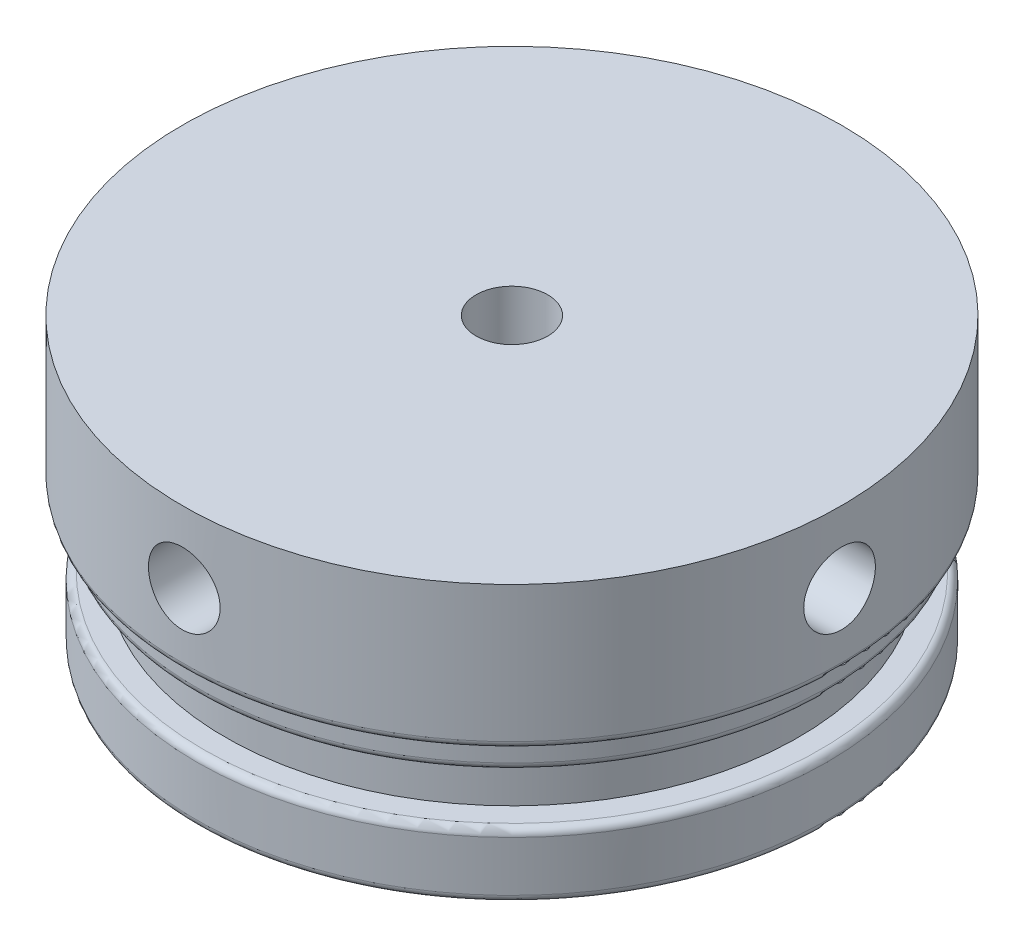
ISO-10303-21;
HEADER;
FILE_DESCRIPTION(('STEP AP214'),'2;1');
FILE_NAME('part.step','',(''),(''),'','','');
FILE_SCHEMA(('AUTOMOTIVE_DESIGN { 1 0 10303 214 1 1 1 1 }'));
ENDSEC;
DATA;
#1=APPLICATION_CONTEXT('core data for automotive mechanical design processes');
#2=APPLICATION_PROTOCOL_DEFINITION('international standard','automotive_design',2000,#1);
#3=PRODUCT_CONTEXT('',#1,'mechanical');
#4=PRODUCT('Part','Part','',(#3));
#5=PRODUCT_RELATED_PRODUCT_CATEGORY('part','',(#4));
#6=PRODUCT_DEFINITION_FORMATION('','',#4);
#7=PRODUCT_DEFINITION_CONTEXT('part definition',#1,'design');
#8=PRODUCT_DEFINITION('design','',#6,#7);
#9=PRODUCT_DEFINITION_SHAPE('','',#8);
#10=(LENGTH_UNIT() NAMED_UNIT(*) SI_UNIT(.MILLI.,.METRE.));
#11=(NAMED_UNIT(*) PLANE_ANGLE_UNIT() SI_UNIT($,.RADIAN.));
#12=(NAMED_UNIT(*) SI_UNIT($,.STERADIAN.) SOLID_ANGLE_UNIT());
#13=UNCERTAINTY_MEASURE_WITH_UNIT(LENGTH_MEASURE(1.E-05),#10,'distance_accuracy_value','');
#14=(GEOMETRIC_REPRESENTATION_CONTEXT(3) GLOBAL_UNCERTAINTY_ASSIGNED_CONTEXT((#13)) GLOBAL_UNIT_ASSIGNED_CONTEXT((#10,
#11,#12)) REPRESENTATION_CONTEXT('',''));
#15=CARTESIAN_POINT('',(0.,0.,0.));
#16=DIRECTION('',(0.,0.,1.));
#17=DIRECTION('',(1.,0.,0.));
#18=AXIS2_PLACEMENT_3D('',#15,#16,#17);
#19=CARTESIAN_POINT('',(22.,0.,0.));
#20=DIRECTION('',(0.,-1.,0.));
#21=DIRECTION('',(0.,0.,-1.));
#22=AXIS2_PLACEMENT_3D('',#19,#20,#21);
#23=PLANE('',#22);
#24=CARTESIAN_POINT('',(0.,0.,0.));
#25=DIRECTION('',(0.,-1.,0.));
#26=DIRECTION('',(0.,0.,-1.));
#27=AXIS2_PLACEMENT_3D('',#24,#25,#26);
#28=CIRCLE('',#27,21.5);
#29=CARTESIAN_POINT('',(0.,0.,-21.5));
#30=VERTEX_POINT('',#29);
#31=EDGE_CURVE('E55',#30,#30,#28,.T.);
#32=ORIENTED_EDGE('',*,*,#31,.T.);
#33=EDGE_LOOP('',(#32));
#34=FACE_BOUND('',#33,.T.);
#35=ADVANCED_FACE('F40',(#34),#23,.T.);
#36=CARTESIAN_POINT('',(0.,20.,0.));
#37=DIRECTION('',(0.,1.,0.));
#38=DIRECTION('',(0.,0.,1.));
#39=AXIS2_PLACEMENT_3D('',#36,#37,#38);
#40=PLANE('',#39);
#41=CARTESIAN_POINT('',(0.,20.,0.));
#42=DIRECTION('',(0.,1.,0.));
#43=DIRECTION('',(0.,0.,1.));
#44=AXIS2_PLACEMENT_3D('',#41,#42,#43);
#45=CIRCLE('',#44,2.5);
#46=CARTESIAN_POINT('',(0.,20.,2.5));
#47=VERTEX_POINT('',#46);
#48=EDGE_CURVE('E368',#47,#47,#45,.T.);
#49=ORIENTED_EDGE('',*,*,#48,.F.);
#50=EDGE_LOOP('',(#49));
#51=FACE_BOUND('',#50,.T.);
#52=CARTESIAN_POINT('',(0.,20.,0.));
#53=DIRECTION('',(0.,-1.,0.));
#54=DIRECTION('',(0.,0.,-1.));
#55=AXIS2_PLACEMENT_3D('',#52,#53,#54);
#56=CIRCLE('',#55,23.);
#57=CARTESIAN_POINT('',(0.,20.,-23.));
#58=VERTEX_POINT('',#57);
#59=EDGE_CURVE('E127',#58,#58,#56,.T.);
#60=ORIENTED_EDGE('',*,*,#59,.F.);
#61=EDGE_LOOP('',(#60));
#62=FACE_BOUND('',#61,.T.);
#63=ADVANCED_FACE('F158',(#51,#62),#40,.T.);
#64=CARTESIAN_POINT('',(0.,0.,0.));
#65=DIRECTION('',(0.,-1.,0.));
#66=DIRECTION('',(0.,0.,-1.));
#67=AXIS2_PLACEMENT_3D('',#64,#65,#66);
#68=CYLINDRICAL_SURFACE('',#67,23.);
#69=CARTESIAN_POINT('',(0.,10.5,0.));
#70=DIRECTION('',(0.,-1.,0.));
#71=DIRECTION('',(0.,0.,-1.));
#72=AXIS2_PLACEMENT_3D('',#69,#70,#71);
#73=CIRCLE('',#72,23.);
#74=CARTESIAN_POINT('',(0.,10.5,-23.));
#75=VERTEX_POINT('',#74);
#76=EDGE_CURVE('E10',#75,#75,#73,.F.);
#77=ORIENTED_EDGE('',*,*,#76,.T.);
#78=EDGE_LOOP('',(#77));
#79=FACE_BOUND('',#78,.T.);
#80=CARTESIAN_POINT('',(2.5,15.,22.8637267303474));
#81=CARTESIAN_POINT('',(2.4999939701255,15.139980349044,22.863728503521));
#82=CARTESIAN_POINT('',(2.48820368084452,15.2800516210515,22.8650261108921));
#83=CARTESIAN_POINT('',(2.44135067528366,15.5563059082258,22.8700752206109));
#84=CARTESIAN_POINT('',(2.40626274061508,15.6924845430413,22.8738293819759));
#85=CARTESIAN_POINT('',(2.31385239669296,15.9569132584398,22.883361452979));
#86=CARTESIAN_POINT('',(2.25654398652915,16.0851682721093,22.8891380882193));
#87=CARTESIAN_POINT('',(2.12134741021566,16.3302130471617,22.9020626705421));
#88=CARTESIAN_POINT('',(2.04346314697372,16.4470049771508,22.9092103574879));
#89=CARTESIAN_POINT('',(1.86896896867891,16.6663332977612,22.9241058533277));
#90=CARTESIAN_POINT('',(1.77228897614597,16.7688137935683,22.9318558408166));
#91=CARTESIAN_POINT('',(1.56309794133541,16.9561283685045,22.9470630013336));
#92=CARTESIAN_POINT('',(1.45058615516232,17.0409616179701,22.9545201605813));
#93=CARTESIAN_POINT('',(1.21257954402684,17.1907695377898,22.9683232666031));
#94=CARTESIAN_POINT('',(1.08705314145865,17.2556943201376,22.9746664050827));
#95=CARTESIAN_POINT('',(0.826799194064805,17.3635230635642,22.9855029727916));
#96=CARTESIAN_POINT('',(0.692071911347285,17.4064276516424,22.989996454687));
#97=CARTESIAN_POINT('',(0.417808135467894,17.468833017808,22.9966121031838));
#98=CARTESIAN_POINT('',(0.278292861863883,17.4884260468078,22.9987436145036));
#99=CARTESIAN_POINT('',(-0.00206087025133014,17.5039377106599,23.0004269854885));
#100=CARTESIAN_POINT('',(-0.142899288585411,17.4998570620556,22.9999789232308));
#101=CARTESIAN_POINT('',(-0.421274729947659,17.4682117798936,22.99656125057));
#102=CARTESIAN_POINT('',(-0.558823179142969,17.440746347983,22.9936022919314));
#103=CARTESIAN_POINT('',(-0.827346629918954,17.3632658564636,22.9855074565526));
#104=CARTESIAN_POINT('',(-0.95832153296524,17.3132504589535,22.9803715471919));
#105=CARTESIAN_POINT('',(-1.21029089072141,17.1919820812213,22.9684817605684));
#106=CARTESIAN_POINT('',(-1.33126420605012,17.1206855161404,22.9617245684661));
#107=CARTESIAN_POINT('',(-1.55956575445769,16.9589103142736,22.9473497213629));
#108=CARTESIAN_POINT('',(-1.66689351411387,16.8684310122469,22.9397320365252));
#109=CARTESIAN_POINT('',(-1.86543892909733,16.6703015327477,22.9244438310016));
#110=CARTESIAN_POINT('',(-1.95657043227679,16.5625650057717,22.9167732407579));
#111=CARTESIAN_POINT('',(-2.11946862499195,16.3332778082672,22.9022828999055));
#112=CARTESIAN_POINT('',(-2.19123527738894,16.2117271112458,22.8954631509285));
#113=CARTESIAN_POINT('',(-2.31336787576821,15.9581923419854,22.8834462992027));
#114=CARTESIAN_POINT('',(-2.36372799118512,15.8262054387994,22.8782496386416));
#115=CARTESIAN_POINT('',(-2.44154715892134,15.5555799033895,22.8700763500121));
#116=CARTESIAN_POINT('',(-2.46900703878971,15.4169415117228,22.8670996417214));
#117=CARTESIAN_POINT('',(-2.50013437561912,15.1377062285502,22.8637174684446));
#118=CARTESIAN_POINT('',(-2.50392258990053,14.9971229500576,22.8632989534723));
#119=CARTESIAN_POINT('',(-2.4879166773991,14.7173236758392,22.865046093856));
#120=CARTESIAN_POINT('',(-2.46812292829153,14.5781076582522,22.867211707826));
#121=CARTESIAN_POINT('',(-2.40561620286071,14.3053499113863,22.8738712149308));
#122=CARTESIAN_POINT('',(-2.36296076838645,14.1717948405227,22.8783592616311));
#123=CARTESIAN_POINT('',(-2.25600040376674,13.9137345563564,22.889153208616));
#124=CARTESIAN_POINT('',(-2.19169489107553,13.7892295866773,22.8954591578148));
#125=CARTESIAN_POINT('',(-2.04295907217365,13.5522546382941,22.9092098807491));
#126=CARTESIAN_POINT('',(-1.95844901306768,13.4398349794615,22.9166591245717));
#127=CARTESIAN_POINT('',(-1.77181683178554,13.2307331280403,22.9318426692574));
#128=CARTESIAN_POINT('',(-1.66969419376571,13.1340513965512,22.9395769784643));
#129=CARTESIAN_POINT('',(-1.45021068234105,12.9587508975031,22.9544988220694));
#130=CARTESIAN_POINT('',(-1.33278654931749,12.8802110930454,22.9616838784019));
#131=CARTESIAN_POINT('',(-1.08634417701471,12.7439682377605,22.9746612802643));
#132=CARTESIAN_POINT('',(-0.957326121403719,12.6862648569201,22.9804536478515));
#133=CARTESIAN_POINT('',(-0.691629593524416,12.593465538567,22.9899819079437));
#134=CARTESIAN_POINT('',(-0.554967705182031,12.5583225760264,22.9937220756812));
#135=CARTESIAN_POINT('',(-0.277640067424125,12.5114883508147,22.9987421363902));
#136=CARTESIAN_POINT('',(-0.136974452584955,12.4997963008353,23.0000221119568));
#137=CARTESIAN_POINT('',(0.143593571840013,12.500208028853,22.9999774172745));
#138=CARTESIAN_POINT('',(0.283496179029067,12.5121894959703,22.9986661349357));
#139=CARTESIAN_POINT('',(0.559288090558206,12.5593508384812,22.9936127244095));
#140=CARTESIAN_POINT('',(0.695177393428898,12.5945307223682,22.9898705953322));
#141=CARTESIAN_POINT('',(0.959079384133351,12.6870548708379,22.9803745041723));
#142=CARTESIAN_POINT('',(1.08709360681903,12.7443948004649,22.9746209355892));
#143=CARTESIAN_POINT('',(1.3317006907294,12.8795985557844,22.9617419390985));
#144=CARTESIAN_POINT('',(1.44829355243092,12.9574623806201,22.9546165112483));
#145=CARTESIAN_POINT('',(1.66737471542485,13.1319607144011,22.9397471051313));
#146=CARTESIAN_POINT('',(1.76979023345884,13.2286863587875,22.9320002357215));
#147=CARTESIAN_POINT('',(1.95698813672569,13.4379785276372,22.916785167962));
#148=CARTESIAN_POINT('',(2.04176630450345,13.5505488301217,22.9093170366138));
#149=CARTESIAN_POINT('',(2.19148739105867,13.7887062810012,22.8954814380875));
#150=CARTESIAN_POINT('',(2.25637092337926,13.9143309312584,22.8891172904422));
#151=CARTESIAN_POINT('',(2.36403366988141,14.174684645339,22.8782494843252));
#152=CARTESIAN_POINT('',(2.40683752967866,14.3094033673857,22.8737437525969));
#153=CARTESIAN_POINT('',(2.45858857992493,14.5373871679772,22.8682256809288));
#154=CARTESIAN_POINT('',(2.47409628664423,14.6292005418664,22.8665466879211));
#155=CARTESIAN_POINT('',(2.49480397341287,14.8139958970765,22.8642966263419));
#156=CARTESIAN_POINT('',(2.50000400707499,14.9069778723167,22.8637255520078));
#157=CARTESIAN_POINT('',(2.5,15.,22.8637267303474));
#158=B_SPLINE_CURVE_WITH_KNOTS('',3,(#80,#81,#82,#83,#84,#85,#86,#87,#88,#89,#90,#91,#92,#93,
#94,#95,#96,#97,#98,#99,#100,#101,#102,#103,#104,#105,#106,#107,#108,#109,#110,#111,#112,#113,
#114,#115,#116,#117,#118,#119,#120,#121,#122,#123,#124,#125,#126,#127,#128,#129,#130,#131,#132,
#133,#134,#135,#136,#137,#138,#139,#140,#141,#142,#143,#144,#145,#146,#147,#148,#149,#150,#151,
#152,#153,#154,#155,#156,#157),.UNSPECIFIED.,.T.,.F.,(4,2,2,2,2,2,2,2,2,2,2,2,2,2,2,2,2,2,2,2,2,
2,2,2,2,2,2,2,2,2,2,2,2,2,2,2,2,2,4),(0.,0.4196013082182,0.839657553278073,1.25944958818291,
1.67916205240512,2.10047045748941,2.5217986653919,2.94417419742189,3.36653770213316,
3.78722416731331,4.20789789942657,4.6267959132982,5.04570020438138,5.46546838807366,
5.88525113134805,6.30720400892865,6.72915769574196,7.15122623787007,7.57327952698631,
7.99317800727378,8.41306976279695,8.83190959865592,9.25076070527651,9.67129325277202,
10.0918381190714,10.5141803028703,10.9365157972019,11.3579680905942,11.7794062344966,
12.1986726819753,12.6179392829583,13.0371239083495,13.4563085162399,13.8775710785496,
14.2989342579595,14.7215432495404,15.143679493152,15.4225215574387,15.7013621713943),.UNSPECIFIED.);
#159=CARTESIAN_POINT('',(2.5,15.,22.8637267303474));
#160=VERTEX_POINT('',#159);
#161=EDGE_CURVE('E68',#160,#160,#158,.T.);
#162=ORIENTED_EDGE('',*,*,#161,.F.);
#163=EDGE_LOOP('',(#162));
#164=FACE_BOUND('',#163,.T.);
#165=CARTESIAN_POINT('',(22.8637267303474,15.,-2.5));
#166=CARTESIAN_POINT('',(22.863728503521,15.139980349044,-2.4999939701255));
#167=CARTESIAN_POINT('',(22.8650261108921,15.2800516210515,-2.48820368084452));
#168=CARTESIAN_POINT('',(22.8700752206109,15.5563059082258,-2.44135067528366));
#169=CARTESIAN_POINT('',(22.8738293819759,15.6924845430413,-2.40626274061508));
#170=CARTESIAN_POINT('',(22.883361452979,15.9569132584398,-2.31385239669296));
#171=CARTESIAN_POINT('',(22.8891380882193,16.0851682721093,-2.25654398652915));
#172=CARTESIAN_POINT('',(22.9020626705421,16.3302130471617,-2.12134741021566));
#173=CARTESIAN_POINT('',(22.9092103574879,16.4470049771508,-2.04346314697372));
#174=CARTESIAN_POINT('',(22.9241058533277,16.6663332977612,-1.86896896867891));
#175=CARTESIAN_POINT('',(22.9318558408166,16.7688137935683,-1.77228897614597));
#176=CARTESIAN_POINT('',(22.9470630013336,16.9561283685045,-1.56309794133541));
#177=CARTESIAN_POINT('',(22.9545201605813,17.0409616179701,-1.45058615516232));
#178=CARTESIAN_POINT('',(22.9683232666031,17.1907695377898,-1.21257954402684));
#179=CARTESIAN_POINT('',(22.9746664050827,17.2556943201376,-1.08705314145865));
#180=CARTESIAN_POINT('',(22.9855029727916,17.3635230635642,-0.826799194064805));
#181=CARTESIAN_POINT('',(22.989996454687,17.4064276516424,-0.692071911347285));
#182=CARTESIAN_POINT('',(22.9966121031838,17.468833017808,-0.417808135467894));
#183=CARTESIAN_POINT('',(22.9987436145036,17.4884260468078,-0.278292861863883));
#184=CARTESIAN_POINT('',(23.0004269854885,17.5039377106599,0.00206087025133008));
#185=CARTESIAN_POINT('',(22.9999789232308,17.4998570620556,0.142899288585411));
#186=CARTESIAN_POINT('',(22.99656125057,17.4682117798936,0.421274729947659));
#187=CARTESIAN_POINT('',(22.9936022919314,17.440746347983,0.558823179142969));
#188=CARTESIAN_POINT('',(22.9855074565526,17.3632658564636,0.827346629918954));
#189=CARTESIAN_POINT('',(22.9803715471919,17.3132504589535,0.95832153296524));
#190=CARTESIAN_POINT('',(22.9684817605684,17.1919820812213,1.21029089072141));
#191=CARTESIAN_POINT('',(22.9617245684661,17.1206855161404,1.33126420605012));
#192=CARTESIAN_POINT('',(22.9473497213629,16.9589103142736,1.55956575445769));
#193=CARTESIAN_POINT('',(22.9397320365252,16.8684310122469,1.66689351411387));
#194=CARTESIAN_POINT('',(22.9244438310016,16.6703015327477,1.86543892909733));
#195=CARTESIAN_POINT('',(22.9167732407579,16.5625650057717,1.95657043227679));
#196=CARTESIAN_POINT('',(22.9022828999055,16.3332778082672,2.11946862499195));
#197=CARTESIAN_POINT('',(22.8954631509285,16.2117271112458,2.19123527738894));
#198=CARTESIAN_POINT('',(22.8834462992027,15.9581923419854,2.31336787576821));
#199=CARTESIAN_POINT('',(22.8782496386416,15.8262054387994,2.36372799118512));
#200=CARTESIAN_POINT('',(22.8700763500121,15.5555799033895,2.44154715892134));
#201=CARTESIAN_POINT('',(22.8670996417214,15.4169415117228,2.46900703878971));
#202=CARTESIAN_POINT('',(22.8637174684446,15.1377062285502,2.50013437561912));
#203=CARTESIAN_POINT('',(22.8632989534723,14.9971229500576,2.50392258990053));
#204=CARTESIAN_POINT('',(22.865046093856,14.7173236758392,2.4879166773991));
#205=CARTESIAN_POINT('',(22.867211707826,14.5781076582522,2.46812292829153));
#206=CARTESIAN_POINT('',(22.8738712149308,14.3053499113863,2.40561620286071));
#207=CARTESIAN_POINT('',(22.8783592616311,14.1717948405227,2.36296076838645));
#208=CARTESIAN_POINT('',(22.889153208616,13.9137345563564,2.25600040376674));
#209=CARTESIAN_POINT('',(22.8954591578148,13.7892295866773,2.19169489107553));
#210=CARTESIAN_POINT('',(22.9092098807491,13.5522546382941,2.04295907217365));
#211=CARTESIAN_POINT('',(22.9166591245717,13.4398349794615,1.95844901306768));
#212=CARTESIAN_POINT('',(22.9318426692574,13.2307331280403,1.77181683178554));
#213=CARTESIAN_POINT('',(22.9395769784643,13.1340513965512,1.66969419376571));
#214=CARTESIAN_POINT('',(22.9544988220694,12.9587508975031,1.45021068234105));
#215=CARTESIAN_POINT('',(22.9616838784019,12.8802110930454,1.33278654931749));
#216=CARTESIAN_POINT('',(22.9746612802643,12.7439682377605,1.08634417701471));
#217=CARTESIAN_POINT('',(22.9804536478515,12.6862648569201,0.957326121403719));
#218=CARTESIAN_POINT('',(22.9899819079437,12.593465538567,0.691629593524417));
#219=CARTESIAN_POINT('',(22.9937220756812,12.5583225760264,0.554967705182031));
#220=CARTESIAN_POINT('',(22.9987421363902,12.5114883508147,0.277640067424124));
#221=CARTESIAN_POINT('',(23.0000221119568,12.4997963008353,0.136974452584955));
#222=CARTESIAN_POINT('',(22.9999774172745,12.500208028853,-0.143593571840013));
#223=CARTESIAN_POINT('',(22.9986661349357,12.5121894959703,-0.283496179029067));
#224=CARTESIAN_POINT('',(22.9936127244095,12.5593508384812,-0.559288090558206));
#225=CARTESIAN_POINT('',(22.9898705953322,12.5945307223682,-0.695177393428898));
#226=CARTESIAN_POINT('',(22.9803745041723,12.6870548708379,-0.959079384133351));
#227=CARTESIAN_POINT('',(22.9746209355892,12.7443948004649,-1.08709360681903));
#228=CARTESIAN_POINT('',(22.9617419390985,12.8795985557844,-1.3317006907294));
#229=CARTESIAN_POINT('',(22.9546165112483,12.9574623806201,-1.44829355243092));
#230=CARTESIAN_POINT('',(22.9397471051313,13.1319607144011,-1.66737471542485));
#231=CARTESIAN_POINT('',(22.9320002357215,13.2286863587875,-1.76979023345884));
#232=CARTESIAN_POINT('',(22.916785167962,13.4379785276372,-1.95698813672569));
#233=CARTESIAN_POINT('',(22.9093170366138,13.5505488301217,-2.04176630450345));
#234=CARTESIAN_POINT('',(22.8954814380875,13.7887062810012,-2.19148739105867));
#235=CARTESIAN_POINT('',(22.8891172904422,13.9143309312584,-2.25637092337926));
#236=CARTESIAN_POINT('',(22.8782494843252,14.174684645339,-2.36403366988141));
#237=CARTESIAN_POINT('',(22.8737437525969,14.3094033673857,-2.40683752967866));
#238=CARTESIAN_POINT('',(22.8682256809288,14.5373871679772,-2.45858857992493));
#239=CARTESIAN_POINT('',(22.8665466879211,14.6292005418664,-2.47409628664423));
#240=CARTESIAN_POINT('',(22.8642966263419,14.8139958970765,-2.49480397341287));
#241=CARTESIAN_POINT('',(22.8637255520078,14.9069778723167,-2.50000400707499));
#242=CARTESIAN_POINT('',(22.8637267303474,15.,-2.5));
#243=B_SPLINE_CURVE_WITH_KNOTS('',3,(#165,#166,#167,#168,#169,#170,#171,#172,#173,#174,#175,
#176,#177,#178,#179,#180,#181,#182,#183,#184,#185,#186,#187,#188,#189,#190,#191,#192,#193,#194,
#195,#196,#197,#198,#199,#200,#201,#202,#203,#204,#205,#206,#207,#208,#209,#210,#211,#212,#213,
#214,#215,#216,#217,#218,#219,#220,#221,#222,#223,#224,#225,#226,#227,#228,#229,#230,#231,#232,
#233,#234,#235,#236,#237,#238,#239,#240,#241,#242),.UNSPECIFIED.,.T.,.F.,(4,2,2,2,2,2,2,2,2,2,2,
2,2,2,2,2,2,2,2,2,2,2,2,2,2,2,2,2,2,2,2,2,2,2,2,2,2,2,4),(0.,0.4196013082182,0.839657553278073,
1.25944958818291,1.67916205240512,2.10047045748941,2.5217986653919,2.94417419742189,
3.36653770213316,3.78722416731331,4.20789789942657,4.6267959132982,5.04570020438138,
5.46546838807366,5.88525113134805,6.30720400892865,6.72915769574196,7.15122623787007,
7.57327952698631,7.99317800727378,8.41306976279695,8.83190959865592,9.25076070527651,
9.67129325277202,10.0918381190714,10.5141803028703,10.9365157972019,11.3579680905942,
11.7794062344966,12.1986726819753,12.6179392829583,13.0371239083495,13.4563085162399,
13.8775710785496,14.2989342579595,14.7215432495403,15.143679493152,15.4225215574387,
15.7013621713943),.UNSPECIFIED.);
#244=CARTESIAN_POINT('',(22.8637267303474,15.,-2.5));
#245=VERTEX_POINT('',#244);
#246=EDGE_CURVE('E80',#245,#245,#243,.T.);
#247=ORIENTED_EDGE('',*,*,#246,.F.);
#248=EDGE_LOOP('',(#247));
#249=FACE_BOUND('',#248,.T.);
#250=CARTESIAN_POINT('',(0.,17.5,-23.));
#251=CARTESIAN_POINT('',(0.139983103144771,17.4999939725767,-22.9999982651853));
#252=CARTESIAN_POINT('',(0.280057120776915,17.4882032350187,-22.9987084948458));
#253=CARTESIAN_POINT('',(0.556317112462881,17.4413482870468,-22.9936873794586));
#254=CARTESIAN_POINT('',(0.692498708326188,17.4062588678309,-22.9899533898666));
#255=CARTESIAN_POINT('',(0.956933685556339,17.3138441813492,-22.9804650635297));
#256=CARTESIAN_POINT('',(1.08519197493891,17.2565328426493,-22.9747119925468));
#257=CARTESIAN_POINT('',(1.33024224111959,17.1213293693294,-22.9618276849268));
#258=CARTESIAN_POINT('',(1.44703639058549,17.043441144781,-22.9546967101915));
#259=CARTESIAN_POINT('',(1.66636221508884,16.8689429607238,-22.9398209302312));
#260=CARTESIAN_POINT('',(1.76883869592156,16.7722638091343,-22.9320739209226));
#261=CARTESIAN_POINT('',(1.95614551899833,16.5630761433586,-22.9168572838604));
#262=CARTESIAN_POINT('',(2.04097501925932,16.4505668743057,-22.909387669356));
#263=CARTESIAN_POINT('',(2.19077901054473,16.2125624786375,-22.8955493786919));
#264=CARTESIAN_POINT('',(2.25570292718967,16.087035341494,-22.8891835243911));
#265=CARTESIAN_POINT('',(2.36352986761804,15.826779797817,-22.8783015322672));
#266=CARTESIAN_POINT('',(2.40643352858182,15.6920516576524,-22.8737853409228));
#267=CARTESIAN_POINT('',(2.46883696925252,15.4177852159098,-22.8671343864526));
#268=CARTESIAN_POINT('',(2.4884289147849,15.2782681159118,-22.8649902474957));
#269=CARTESIAN_POINT('',(2.50393777886406,14.9979108047423,-22.8632972213779));
#270=CARTESIAN_POINT('',(2.49985542576871,14.8570706344093,-22.8637482543746));
#271=CARTESIAN_POINT('',(2.46820743728846,14.5787026893699,-22.8671860401819));
#272=CARTESIAN_POINT('',(2.44074271961946,14.4411632876416,-22.8701618957306));
#273=CARTESIAN_POINT('',(2.36326678965561,14.1726575627445,-22.8782970145345));
#274=CARTESIAN_POINT('',(2.31325522324367,14.041691342849,-22.8834563120823));
#275=CARTESIAN_POINT('',(2.19199479384591,13.7897325408429,-22.8953894818129));
#276=CARTESIAN_POINT('',(2.12070145475149,13.6687615301517,-22.9021667292993));
#277=CARTESIAN_POINT('',(1.95893314658802,13.4404632244076,-22.9165694114385));
#278=CARTESIAN_POINT('',(1.8684575138205,13.3331364016428,-22.9241948754351));
#279=CARTESIAN_POINT('',(1.6703306464759,13.1345868708569,-22.9394833283359));
#280=CARTESIAN_POINT('',(1.56259231085527,13.0434510549971,-22.9471463055725));
#281=CARTESIAN_POINT('',(1.33329995468611,12.8805450212587,-22.96160893779));
#282=CARTESIAN_POINT('',(1.21174591405669,12.8087748315282,-22.9684085915161));
#283=CARTESIAN_POINT('',(0.95821021925894,12.6866396847633,-22.9803812768999));
#284=CARTESIAN_POINT('',(0.826226262849192,12.6362794693863,-22.9855539481647));
#285=CARTESIAN_POINT('',(0.55560713557911,12.5584591996243,-22.9936863289711));
#286=CARTESIAN_POINT('',(0.416972200030584,12.5309983356908,-22.9966461167433));
#287=CARTESIAN_POINT('',(0.13773855578958,12.499867284792,-23.0000091585789));
#288=CARTESIAN_POINT('',(-0.00284664379049257,12.4960772604467,-23.0004252900771));
#289=CARTESIAN_POINT('',(-0.282650194295157,12.5120802384863,-22.9986887400377));
#290=CARTESIAN_POINT('',(-0.421868567066735,12.531872863312,-22.9965360996263));
#291=CARTESIAN_POINT('',(-0.694638188370227,12.5943798332312,-22.9899120423977));
#292=CARTESIAN_POINT('',(-0.828202521796152,12.6370377345831,-22.985446336375));
#293=CARTESIAN_POINT('',(-1.08628024050495,12.7440061330293,-22.9746967852232));
#294=CARTESIAN_POINT('',(-1.21079338827186,12.8083171980841,-22.9684128924039));
#295=CARTESIAN_POINT('',(-1.44777396073726,12.9570612185381,-22.9546969764631));
#296=CARTESIAN_POINT('',(-1.56019195181221,13.0415725169502,-22.9472605238345));
#297=CARTESIAN_POINT('',(-1.76928986149024,13.2282061953843,-22.9320872359889));
#298=CARTESIAN_POINT('',(-1.86596931161292,13.330329099455,-22.9243503918387));
#299=CARTESIAN_POINT('',(-2.04126480667453,13.5498116258598,-22.9094092387958));
#300=CARTESIAN_POINT('',(-2.11980194313159,13.6672344583873,-22.9022073453689));
#301=CARTESIAN_POINT('',(-2.25604011850518,13.9136735111928,-22.8891892949747));
#302=CARTESIAN_POINT('',(-2.31374148646464,14.0426895483482,-22.8833731161244));
#303=CARTESIAN_POINT('',(-2.40653948968605,14.3083872902743,-22.8738006105397));
#304=CARTESIAN_POINT('',(-2.44168227770985,14.4450527178846,-22.8700400804947));
#305=CARTESIAN_POINT('',(-2.48851495487778,14.722387826047,-22.8649919549761));
#306=CARTESIAN_POINT('',(-2.50020565030708,14.8630573687686,-22.8637042744857));
#307=CARTESIAN_POINT('',(-2.49978993977328,15.1436231264866,-22.8637496685648));
#308=CARTESIAN_POINT('',(-2.48780748641828,15.2835195437563,-22.8650690923415));
#309=CARTESIAN_POINT('',(-2.44064634751787,15.5592988274022,-22.8701508463211));
#310=CARTESIAN_POINT('',(-2.40546764259014,15.6951816904247,-22.8739131785652));
#311=CARTESIAN_POINT('',(-2.31294831594734,15.9590706611174,-22.8834529043781));
#312=CARTESIAN_POINT('',(-2.25561210413343,16.0870783302765,-22.8892298969564));
#313=CARTESIAN_POINT('',(-2.12041781575575,16.3316738563351,-22.9021487912866));
#314=CARTESIAN_POINT('',(-2.04255973273732,16.4482617096427,-22.9092906934678));
#315=CARTESIAN_POINT('',(-1.86806775145211,16.6673430757438,-22.9241795292515));
#316=CARTESIAN_POINT('',(-1.77134140203253,16.7697627623157,-22.9319293248338));
#317=CARTESIAN_POINT('',(-1.56204610281153,16.9569687469843,-22.9471348300906));
#318=CARTESIAN_POINT('',(-1.44947338443648,17.0417508386,-22.9545904692675));
#319=CARTESIAN_POINT('',(-1.21131392802786,17.191476191454,-22.9683908248194));
#320=CARTESIAN_POINT('',(-1.08569012419725,17.2563607597749,-22.9747322314223));
#321=CARTESIAN_POINT('',(-0.82533819765789,17.3640256769731,-22.9855546575156));
#322=CARTESIAN_POINT('',(-0.690620410883533,17.4068306579353,-22.9900377490487));
#323=CARTESIAN_POINT('',(-0.46263361648976,17.458584837459,-22.9955266348553));
#324=CARTESIAN_POINT('',(-0.370816092650863,17.4740939527829,-22.9971962123466));
#325=CARTESIAN_POINT('',(-0.186012425476147,17.4948035105788,-22.9994334685521));
#326=CARTESIAN_POINT('',(-0.0930262880938036,17.5000040055464,-23.0000011528775));
#327=CARTESIAN_POINT('',(0.,17.5,-23.));
#328=B_SPLINE_CURVE_WITH_KNOTS('',3,(#250,#251,#252,#253,#254,#255,#256,#257,#258,#259,#260,
#261,#262,#263,#264,#265,#266,#267,#268,#269,#270,#271,#272,#273,#274,#275,#276,#277,#278,#279,
#280,#281,#282,#283,#284,#285,#286,#287,#288,#289,#290,#291,#292,#293,#294,#295,#296,#297,#298,
#299,#300,#301,#302,#303,#304,#305,#306,#307,#308,#309,#310,#311,#312,#313,#314,#315,#316,#317,
#318,#319,#320,#321,#322,#323,#324,#325,#326,#327),.UNSPECIFIED.,.T.,.F.,(4,2,2,2,2,2,2,2,2,2,2,
2,2,2,2,2,2,2,2,2,2,2,2,2,2,2,2,2,2,2,2,2,2,2,2,2,2,2,4),(0.,0.419609581259757,
0.839673914842075,1.25947537913336,1.6791971289991,2.10049470705803,2.52181238170566,
2.9441917988072,3.36655899320606,3.78725069710156,4.20792945816461,4.62680173108575,
5.04568058297485,5.46544103941864,5.88521602175028,6.30717989465379,6.72914438088219,
7.15120227077149,7.57324523923839,7.9931498045906,8.4130476473405,8.83191369912414,
9.25079073858305,9.67131945845658,10.0918606936869,10.5141979738353,10.9365285840511,
11.3579923676798,11.7794416610953,12.1986900939373,12.6179388770954,13.0371042621384,
13.4562697790198,13.8775432018089,14.2989169813788,14.7215220146868,15.143654562704,
15.4225090794152,15.7013621760837),.UNSPECIFIED.);
#329=CARTESIAN_POINT('',(0.,17.5,-23.));
#330=VERTEX_POINT('',#329);
#331=EDGE_CURVE('E111',#330,#330,#328,.T.);
#332=ORIENTED_EDGE('',*,*,#331,.F.);
#333=EDGE_LOOP('',(#332));
#334=FACE_BOUND('',#333,.T.);
#335=CARTESIAN_POINT('',(-22.8637267303474,15.,2.5));
#336=CARTESIAN_POINT('',(-22.863728503521,15.139980349044,2.4999939701255));
#337=CARTESIAN_POINT('',(-22.8650261108921,15.2800516210515,2.48820368084452));
#338=CARTESIAN_POINT('',(-22.8700752206109,15.5563059082258,2.44135067528366));
#339=CARTESIAN_POINT('',(-22.8738293819759,15.6924845430413,2.40626274061508));
#340=CARTESIAN_POINT('',(-22.883361452979,15.9569132584398,2.31385239669296));
#341=CARTESIAN_POINT('',(-22.8891380882193,16.0851682721093,2.25654398652915));
#342=CARTESIAN_POINT('',(-22.9020626705421,16.3302130471617,2.12134741021566));
#343=CARTESIAN_POINT('',(-22.9092103574879,16.4470049771508,2.04346314697372));
#344=CARTESIAN_POINT('',(-22.9241058533277,16.6663332977612,1.86896896867891));
#345=CARTESIAN_POINT('',(-22.9318558408166,16.7688137935683,1.77228897614597));
#346=CARTESIAN_POINT('',(-22.9470630013336,16.9561283685045,1.56309794133541));
#347=CARTESIAN_POINT('',(-22.9545201605813,17.0409616179701,1.45058615516232));
#348=CARTESIAN_POINT('',(-22.9683232666031,17.1907695377898,1.21257954402684));
#349=CARTESIAN_POINT('',(-22.9746664050827,17.2556943201376,1.08705314145865));
#350=CARTESIAN_POINT('',(-22.9855029727916,17.3635230635642,0.826799194064805));
#351=CARTESIAN_POINT('',(-22.989996454687,17.4064276516424,0.692071911347285));
#352=CARTESIAN_POINT('',(-22.9966121031838,17.468833017808,0.417808135467894));
#353=CARTESIAN_POINT('',(-22.9987436145036,17.4884260468078,0.278292861863883));
#354=CARTESIAN_POINT('',(-23.0004269854885,17.5039377106599,-0.00206087025133008));
#355=CARTESIAN_POINT('',(-22.9999789232308,17.4998570620556,-0.142899288585411));
#356=CARTESIAN_POINT('',(-22.99656125057,17.4682117798936,-0.421274729947659));
#357=CARTESIAN_POINT('',(-22.9936022919314,17.440746347983,-0.558823179142969));
#358=CARTESIAN_POINT('',(-22.9855074565526,17.3632658564636,-0.827346629918954));
#359=CARTESIAN_POINT('',(-22.9803715471919,17.3132504589535,-0.95832153296524));
#360=CARTESIAN_POINT('',(-22.9684817605684,17.1919820812213,-1.21029089072141));
#361=CARTESIAN_POINT('',(-22.9617245684661,17.1206855161404,-1.33126420605012));
#362=CARTESIAN_POINT('',(-22.9473497213629,16.9589103142736,-1.55956575445769));
#363=CARTESIAN_POINT('',(-22.9397320365252,16.8684310122469,-1.66689351411387));
#364=CARTESIAN_POINT('',(-22.9244438310016,16.6703015327477,-1.86543892909733));
#365=CARTESIAN_POINT('',(-22.9167732407579,16.5625650057717,-1.95657043227679));
#366=CARTESIAN_POINT('',(-22.9022828999055,16.3332778082672,-2.11946862499195));
#367=CARTESIAN_POINT('',(-22.8954631509285,16.2117271112458,-2.19123527738894));
#368=CARTESIAN_POINT('',(-22.8834462992027,15.9581923419854,-2.31336787576821));
#369=CARTESIAN_POINT('',(-22.8782496386416,15.8262054387994,-2.36372799118512));
#370=CARTESIAN_POINT('',(-22.8700763500121,15.5555799033895,-2.44154715892134));
#371=CARTESIAN_POINT('',(-22.8670996417214,15.4169415117228,-2.46900703878971));
#372=CARTESIAN_POINT('',(-22.8637174684446,15.1377062285502,-2.50013437561912));
#373=CARTESIAN_POINT('',(-22.8632989534723,14.9971229500576,-2.50392258990053));
#374=CARTESIAN_POINT('',(-22.865046093856,14.7173236758392,-2.4879166773991));
#375=CARTESIAN_POINT('',(-22.867211707826,14.5781076582522,-2.46812292829153));
#376=CARTESIAN_POINT('',(-22.8738712149308,14.3053499113863,-2.40561620286071));
#377=CARTESIAN_POINT('',(-22.8783592616311,14.1717948405227,-2.36296076838645));
#378=CARTESIAN_POINT('',(-22.889153208616,13.9137345563564,-2.25600040376674));
#379=CARTESIAN_POINT('',(-22.8954591578148,13.7892295866773,-2.19169489107553));
#380=CARTESIAN_POINT('',(-22.9092098807491,13.5522546382941,-2.04295907217365));
#381=CARTESIAN_POINT('',(-22.9166591245717,13.4398349794615,-1.95844901306768));
#382=CARTESIAN_POINT('',(-22.9318426692574,13.2307331280403,-1.77181683178554));
#383=CARTESIAN_POINT('',(-22.9395769784643,13.1340513965512,-1.66969419376571));
#384=CARTESIAN_POINT('',(-22.9544988220694,12.9587508975031,-1.45021068234105));
#385=CARTESIAN_POINT('',(-22.9616838784019,12.8802110930454,-1.33278654931749));
#386=CARTESIAN_POINT('',(-22.9746612802643,12.7439682377605,-1.08634417701471));
#387=CARTESIAN_POINT('',(-22.9804536478515,12.6862648569201,-0.957326121403719));
#388=CARTESIAN_POINT('',(-22.9899819079437,12.593465538567,-0.691629593524417));
#389=CARTESIAN_POINT('',(-22.9937220756812,12.5583225760264,-0.554967705182031));
#390=CARTESIAN_POINT('',(-22.9987421363902,12.5114883508147,-0.277640067424124));
#391=CARTESIAN_POINT('',(-23.0000221119568,12.4997963008353,-0.136974452584955));
#392=CARTESIAN_POINT('',(-22.9999774172745,12.500208028853,0.143593571840013));
#393=CARTESIAN_POINT('',(-22.9986661349357,12.5121894959703,0.283496179029067));
#394=CARTESIAN_POINT('',(-22.9936127244095,12.5593508384812,0.559288090558206));
#395=CARTESIAN_POINT('',(-22.9898705953322,12.5945307223682,0.695177393428898));
#396=CARTESIAN_POINT('',(-22.9803745041723,12.6870548708379,0.959079384133351));
#397=CARTESIAN_POINT('',(-22.9746209355892,12.7443948004649,1.08709360681903));
#398=CARTESIAN_POINT('',(-22.9617419390985,12.8795985557844,1.3317006907294));
#399=CARTESIAN_POINT('',(-22.9546165112483,12.9574623806201,1.44829355243092));
#400=CARTESIAN_POINT('',(-22.9397471051313,13.1319607144011,1.66737471542485));
#401=CARTESIAN_POINT('',(-22.9320002357215,13.2286863587875,1.76979023345884));
#402=CARTESIAN_POINT('',(-22.916785167962,13.4379785276372,1.95698813672569));
#403=CARTESIAN_POINT('',(-22.9093170366138,13.5505488301217,2.04176630450345));
#404=CARTESIAN_POINT('',(-22.8954814380875,13.7887062810012,2.19148739105867));
#405=CARTESIAN_POINT('',(-22.8891172904422,13.9143309312584,2.25637092337926));
#406=CARTESIAN_POINT('',(-22.8782494843252,14.174684645339,2.36403366988141));
#407=CARTESIAN_POINT('',(-22.8737437525969,14.3094033673857,2.40683752967866));
#408=CARTESIAN_POINT('',(-22.8682256809288,14.5373871679772,2.45858857992493));
#409=CARTESIAN_POINT('',(-22.8665466879211,14.6292005418664,2.47409628664423));
#410=CARTESIAN_POINT('',(-22.8642966263419,14.8139958970765,2.49480397341287));
#411=CARTESIAN_POINT('',(-22.8637255520078,14.9069778723167,2.50000400707499));
#412=CARTESIAN_POINT('',(-22.8637267303474,15.,2.5));
#413=B_SPLINE_CURVE_WITH_KNOTS('',3,(#335,#336,#337,#338,#339,#340,#341,#342,#343,#344,#345,
#346,#347,#348,#349,#350,#351,#352,#353,#354,#355,#356,#357,#358,#359,#360,#361,#362,#363,#364,
#365,#366,#367,#368,#369,#370,#371,#372,#373,#374,#375,#376,#377,#378,#379,#380,#381,#382,#383,
#384,#385,#386,#387,#388,#389,#390,#391,#392,#393,#394,#395,#396,#397,#398,#399,#400,#401,#402,
#403,#404,#405,#406,#407,#408,#409,#410,#411,#412),.UNSPECIFIED.,.T.,.F.,(4,2,2,2,2,2,2,2,2,2,2,
2,2,2,2,2,2,2,2,2,2,2,2,2,2,2,2,2,2,2,2,2,2,2,2,2,2,2,4),(0.,0.4196013082182,0.839657553278073,
1.25944958818291,1.67916205240512,2.10047045748941,2.5217986653919,2.94417419742189,
3.36653770213316,3.78722416731331,4.20789789942657,4.6267959132982,5.04570020438138,
5.46546838807366,5.88525113134805,6.30720400892865,6.72915769574196,7.15122623787007,
7.57327952698631,7.99317800727378,8.41306976279695,8.83190959865592,9.25076070527651,
9.67129325277202,10.0918381190714,10.5141803028703,10.9365157972019,11.3579680905942,
11.7794062344966,12.1986726819753,12.6179392829583,13.0371239083495,13.4563085162399,
13.8775710785496,14.2989342579595,14.7215432495403,15.143679493152,15.4225215574387,
15.7013621713943),.UNSPECIFIED.);
#414=CARTESIAN_POINT('',(-22.8637267303474,15.,2.5));
#415=VERTEX_POINT('',#414);
#416=EDGE_CURVE('E119',#415,#415,#413,.T.);
#417=ORIENTED_EDGE('',*,*,#416,.F.);
#418=EDGE_LOOP('',(#417));
#419=FACE_BOUND('',#418,.T.);
#420=ORIENTED_EDGE('',*,*,#59,.T.);
#421=EDGE_LOOP('',(#420));
#422=FACE_BOUND('',#421,.T.);
#423=ADVANCED_FACE('F82',(#79,#164,#249,#334,#419,#422),#68,.T.);
#424=CARTESIAN_POINT('',(23.,10.,0.));
#425=DIRECTION('',(0.,-1.,0.));
#426=DIRECTION('',(0.,0.,-1.));
#427=AXIS2_PLACEMENT_3D('',#424,#425,#426);
#428=PLANE('',#427);
#429=CARTESIAN_POINT('',(0.,10.,0.));
#430=DIRECTION('',(0.,-1.,0.));
#431=DIRECTION('',(0.,0.,-1.));
#432=AXIS2_PLACEMENT_3D('',#429,#430,#431);
#433=CIRCLE('',#432,22.5);
#434=CARTESIAN_POINT('',(0.,10.,-22.5));
#435=VERTEX_POINT('',#434);
#436=EDGE_CURVE('E42',#435,#435,#433,.T.);
#437=ORIENTED_EDGE('',*,*,#436,.T.);
#438=EDGE_LOOP('',(#437));
#439=FACE_BOUND('',#438,.T.);
#440=CARTESIAN_POINT('',(0.,10.,0.));
#441=DIRECTION('',(0.,-1.,0.));
#442=DIRECTION('',(0.,0.,-1.));
#443=AXIS2_PLACEMENT_3D('',#440,#441,#442);
#444=CIRCLE('',#443,22.);
#445=CARTESIAN_POINT('',(0.,10.,-22.));
#446=VERTEX_POINT('',#445);
#447=EDGE_CURVE('E350',#446,#446,#444,.T.);
#448=ORIENTED_EDGE('',*,*,#447,.F.);
#449=EDGE_LOOP('',(#448));
#450=FACE_BOUND('',#449,.T.);
#451=ADVANCED_FACE('F151',(#439,#450),#428,.T.);
#452=CARTESIAN_POINT('',(0.,0.,0.));
#453=DIRECTION('',(0.,-1.,0.));
#454=DIRECTION('',(0.,0.,-1.));
#455=AXIS2_PLACEMENT_3D('',#452,#453,#454);
#456=CYLINDRICAL_SURFACE('',#455,22.);
#457=CARTESIAN_POINT('',(0.,8.5,0.));
#458=DIRECTION('',(0.,-1.,0.));
#459=DIRECTION('',(0.,0.,-1.));
#460=AXIS2_PLACEMENT_3D('',#457,#458,#459);
#461=CIRCLE('',#460,22.);
#462=CARTESIAN_POINT('',(0.,8.5,-22.));
#463=VERTEX_POINT('',#462);
#464=EDGE_CURVE('E61',#463,#463,#461,.F.);
#465=ORIENTED_EDGE('',*,*,#464,.T.);
#466=EDGE_LOOP('',(#465));
#467=FACE_BOUND('',#466,.T.);
#468=ORIENTED_EDGE('',*,*,#447,.T.);
#469=EDGE_LOOP('',(#468));
#470=FACE_BOUND('',#469,.T.);
#471=ADVANCED_FACE('F146',(#467,#470),#456,.T.);
#472=CARTESIAN_POINT('',(22.,8.,0.));
#473=DIRECTION('',(0.,-1.,0.));
#474=DIRECTION('',(0.,0.,-1.));
#475=AXIS2_PLACEMENT_3D('',#472,#473,#474);
#476=PLANE('',#475);
#477=CARTESIAN_POINT('',(0.,8.,0.));
#478=DIRECTION('',(0.,-1.,0.));
#479=DIRECTION('',(0.,0.,-1.));
#480=AXIS2_PLACEMENT_3D('',#477,#478,#479);
#481=CIRCLE('',#480,21.5);
#482=CARTESIAN_POINT('',(0.,8.,-21.5));
#483=VERTEX_POINT('',#482);
#484=EDGE_CURVE('E66',#483,#483,#481,.T.);
#485=ORIENTED_EDGE('',*,*,#484,.T.);
#486=EDGE_LOOP('',(#485));
#487=FACE_BOUND('',#486,.T.);
#488=CARTESIAN_POINT('',(0.,8.,0.));
#489=DIRECTION('',(0.,-1.,0.));
#490=DIRECTION('',(0.,0.,-1.));
#491=AXIS2_PLACEMENT_3D('',#488,#489,#490);
#492=CIRCLE('',#491,20.);
#493=CARTESIAN_POINT('',(0.,8.,-20.));
#494=VERTEX_POINT('',#493);
#495=EDGE_CURVE('E337',#494,#494,#492,.T.);
#496=ORIENTED_EDGE('',*,*,#495,.F.);
#497=EDGE_LOOP('',(#496));
#498=FACE_BOUND('',#497,.T.);
#499=ADVANCED_FACE('F145',(#487,#498),#476,.T.);
#500=CARTESIAN_POINT('',(0.,0.,0.));
#501=DIRECTION('',(0.,-1.,0.));
#502=DIRECTION('',(0.,0.,-1.));
#503=AXIS2_PLACEMENT_3D('',#500,#501,#502);
#504=CYLINDRICAL_SURFACE('',#503,20.);
#505=ORIENTED_EDGE('',*,*,#495,.T.);
#506=EDGE_LOOP('',(#505));
#507=FACE_BOUND('',#506,.T.);
#508=CARTESIAN_POINT('',(0.,4.5,0.));
#509=DIRECTION('',(0.,-1.,0.));
#510=DIRECTION('',(0.,0.,-1.));
#511=AXIS2_PLACEMENT_3D('',#508,#509,#510);
#512=CIRCLE('',#511,20.);
#513=CARTESIAN_POINT('',(0.,4.5,-20.));
#514=VERTEX_POINT('',#513);
#515=EDGE_CURVE('E333',#514,#514,#512,.T.);
#516=ORIENTED_EDGE('',*,*,#515,.F.);
#517=EDGE_LOOP('',(#516));
#518=FACE_BOUND('',#517,.T.);
#519=ADVANCED_FACE('F139',(#507,#518),#504,.T.);
#520=CARTESIAN_POINT('',(20.,4.5,0.));
#521=DIRECTION('',(0.,1.,0.));
#522=DIRECTION('',(0.,0.,1.));
#523=AXIS2_PLACEMENT_3D('',#520,#521,#522);
#524=PLANE('',#523);
#525=CARTESIAN_POINT('',(0.,4.5,0.));
#526=DIRECTION('',(0.,1.,0.));
#527=DIRECTION('',(0.,0.,1.));
#528=AXIS2_PLACEMENT_3D('',#525,#526,#527);
#529=CIRCLE('',#528,21.5);
#530=CARTESIAN_POINT('',(0.,4.5,21.5));
#531=VERTEX_POINT('',#530);
#532=EDGE_CURVE('E60',#531,#531,#529,.T.);
#533=ORIENTED_EDGE('',*,*,#532,.T.);
#534=EDGE_LOOP('',(#533));
#535=FACE_BOUND('',#534,.T.);
#536=ORIENTED_EDGE('',*,*,#515,.T.);
#537=EDGE_LOOP('',(#536));
#538=FACE_BOUND('',#537,.T.);
#539=ADVANCED_FACE('F136',(#535,#538),#524,.T.);
#540=CARTESIAN_POINT('',(0.,0.,0.));
#541=DIRECTION('',(0.,-1.,0.));
#542=DIRECTION('',(0.,0.,-1.));
#543=AXIS2_PLACEMENT_3D('',#540,#541,#542);
#544=CYLINDRICAL_SURFACE('',#543,22.);
#545=CARTESIAN_POINT('',(0.,0.5,0.));
#546=DIRECTION('',(0.,-1.,0.));
#547=DIRECTION('',(0.,0.,-1.));
#548=AXIS2_PLACEMENT_3D('',#545,#546,#547);
#549=CIRCLE('',#548,22.);
#550=CARTESIAN_POINT('',(0.,0.5,-22.));
#551=VERTEX_POINT('',#550);
#552=EDGE_CURVE('E48',#551,#551,#549,.F.);
#553=ORIENTED_EDGE('',*,*,#552,.T.);
#554=EDGE_LOOP('',(#553));
#555=FACE_BOUND('',#554,.T.);
#556=CARTESIAN_POINT('',(0.,4.,0.));
#557=DIRECTION('',(0.,1.,0.));
#558=DIRECTION('',(0.,0.,1.));
#559=AXIS2_PLACEMENT_3D('',#556,#557,#558);
#560=CIRCLE('',#559,22.);
#561=CARTESIAN_POINT('',(0.,4.,22.));
#562=VERTEX_POINT('',#561);
#563=EDGE_CURVE('E58',#562,#562,#560,.F.);
#564=ORIENTED_EDGE('',*,*,#563,.T.);
#565=EDGE_LOOP('',(#564));
#566=FACE_BOUND('',#565,.T.);
#567=ADVANCED_FACE('F135',(#555,#566),#544,.T.);
#568=CARTESIAN_POINT('',(-17.,15.,0.));
#569=DIRECTION('',(-1.,0.,0.));
#570=DIRECTION('',(0.,0.,1.));
#571=AXIS2_PLACEMENT_3D('',#568,#569,#570);
#572=CYLINDRICAL_SURFACE('',#571,2.5);
#573=ORIENTED_EDGE('',*,*,#416,.T.);
#574=EDGE_LOOP('',(#573));
#575=FACE_BOUND('',#574,.T.);
#576=CARTESIAN_POINT('',(-17.,15.,0.));
#577=DIRECTION('',(-1.,0.,0.));
#578=DIRECTION('',(0.,0.,1.));
#579=AXIS2_PLACEMENT_3D('',#576,#577,#578);
#580=CIRCLE('',#579,2.5);
#581=CARTESIAN_POINT('',(-17.,15.,2.5));
#582=VERTEX_POINT('',#581);
#583=EDGE_CURVE('E334',#582,#582,#580,.T.);
#584=ORIENTED_EDGE('',*,*,#583,.F.);
#585=EDGE_LOOP('',(#584));
#586=FACE_BOUND('',#585,.T.);
#587=ADVANCED_FACE('F126',(#575,#586),#572,.F.);
#588=CARTESIAN_POINT('',(-17.,0.,0.));
#589=DIRECTION('',(-1.,0.,0.));
#590=DIRECTION('',(0.,0.,1.));
#591=AXIS2_PLACEMENT_3D('',#588,#589,#590);
#592=PLANE('',#591);
#593=ORIENTED_EDGE('',*,*,#583,.T.);
#594=EDGE_LOOP('',(#593));
#595=FACE_BOUND('',#594,.T.);
#596=ADVANCED_FACE('F112',(#595),#592,.T.);
#597=CARTESIAN_POINT('',(0.,15.,-17.));
#598=DIRECTION('',(0.,0.,-1.));
#599=DIRECTION('',(-1.,0.,0.));
#600=AXIS2_PLACEMENT_3D('',#597,#598,#599);
#601=CYLINDRICAL_SURFACE('',#600,2.5);
#602=ORIENTED_EDGE('',*,*,#331,.T.);
#603=EDGE_LOOP('',(#602));
#604=FACE_BOUND('',#603,.T.);
#605=CARTESIAN_POINT('',(0.,15.,-17.));
#606=DIRECTION('',(0.,0.,-1.));
#607=DIRECTION('',(-1.,0.,0.));
#608=AXIS2_PLACEMENT_3D('',#605,#606,#607);
#609=CIRCLE('',#608,2.5);
#610=CARTESIAN_POINT('',(-2.5,15.,-17.));
#611=VERTEX_POINT('',#610);
#612=EDGE_CURVE('E338',#611,#611,#609,.T.);
#613=ORIENTED_EDGE('',*,*,#612,.F.);
#614=EDGE_LOOP('',(#613));
#615=FACE_BOUND('',#614,.T.);
#616=ADVANCED_FACE('F106',(#604,#615),#601,.F.);
#617=CARTESIAN_POINT('',(0.,0.,-17.));
#618=DIRECTION('',(0.,0.,-1.));
#619=DIRECTION('',(-1.,0.,0.));
#620=AXIS2_PLACEMENT_3D('',#617,#618,#619);
#621=PLANE('',#620);
#622=ORIENTED_EDGE('',*,*,#612,.T.);
#623=EDGE_LOOP('',(#622));
#624=FACE_BOUND('',#623,.T.);
#625=ADVANCED_FACE('F105',(#624),#621,.T.);
#626=CARTESIAN_POINT('',(17.,15.,0.));
#627=DIRECTION('',(1.,0.,0.));
#628=DIRECTION('',(0.,0.,-1.));
#629=AXIS2_PLACEMENT_3D('',#626,#627,#628);
#630=CYLINDRICAL_SURFACE('',#629,2.5);
#631=ORIENTED_EDGE('',*,*,#246,.T.);
#632=EDGE_LOOP('',(#631));
#633=FACE_BOUND('',#632,.T.);
#634=CARTESIAN_POINT('',(17.,15.,0.));
#635=DIRECTION('',(1.,0.,0.));
#636=DIRECTION('',(0.,0.,-1.));
#637=AXIS2_PLACEMENT_3D('',#634,#635,#636);
#638=CIRCLE('',#637,2.5);
#639=CARTESIAN_POINT('',(17.,15.,-2.5));
#640=VERTEX_POINT('',#639);
#641=EDGE_CURVE('E345',#640,#640,#638,.T.);
#642=ORIENTED_EDGE('',*,*,#641,.F.);
#643=EDGE_LOOP('',(#642));
#644=FACE_BOUND('',#643,.T.);
#645=ADVANCED_FACE('F100',(#633,#644),#630,.F.);
#646=CARTESIAN_POINT('',(17.,0.,0.));
#647=DIRECTION('',(1.,0.,0.));
#648=DIRECTION('',(0.,0.,-1.));
#649=AXIS2_PLACEMENT_3D('',#646,#647,#648);
#650=PLANE('',#649);
#651=ORIENTED_EDGE('',*,*,#641,.T.);
#652=EDGE_LOOP('',(#651));
#653=FACE_BOUND('',#652,.T.);
#654=ADVANCED_FACE('F91',(#653),#650,.T.);
#655=CARTESIAN_POINT('',(0.,15.,17.));
#656=DIRECTION('',(0.,0.,1.));
#657=DIRECTION('',(1.,0.,0.));
#658=AXIS2_PLACEMENT_3D('',#655,#656,#657);
#659=CYLINDRICAL_SURFACE('',#658,2.5);
#660=ORIENTED_EDGE('',*,*,#161,.T.);
#661=EDGE_LOOP('',(#660));
#662=FACE_BOUND('',#661,.T.);
#663=CARTESIAN_POINT('',(0.,15.,17.));
#664=DIRECTION('',(0.,0.,1.));
#665=DIRECTION('',(1.,0.,0.));
#666=AXIS2_PLACEMENT_3D('',#663,#664,#665);
#667=CIRCLE('',#666,2.5);
#668=CARTESIAN_POINT('',(2.5,15.,17.));
#669=VERTEX_POINT('',#668);
#670=EDGE_CURVE('E362',#669,#669,#667,.T.);
#671=ORIENTED_EDGE('',*,*,#670,.F.);
#672=EDGE_LOOP('',(#671));
#673=FACE_BOUND('',#672,.T.);
#674=ADVANCED_FACE('F87',(#662,#673),#659,.F.);
#675=CARTESIAN_POINT('',(0.,0.,17.));
#676=DIRECTION('',(0.,0.,1.));
#677=DIRECTION('',(1.,0.,0.));
#678=AXIS2_PLACEMENT_3D('',#675,#676,#677);
#679=PLANE('',#678);
#680=ORIENTED_EDGE('',*,*,#670,.T.);
#681=EDGE_LOOP('',(#680));
#682=FACE_BOUND('',#681,.T.);
#683=ADVANCED_FACE('F95',(#682),#679,.T.);
#684=CARTESIAN_POINT('',(0.,14.,0.));
#685=DIRECTION('',(0.,1.,0.));
#686=DIRECTION('',(0.,0.,1.));
#687=AXIS2_PLACEMENT_3D('',#684,#685,#686);
#688=CYLINDRICAL_SURFACE('',#687,2.5);
#689=CARTESIAN_POINT('',(0.,14.,0.));
#690=DIRECTION('',(0.,1.,0.));
#691=DIRECTION('',(0.,0.,1.));
#692=AXIS2_PLACEMENT_3D('',#689,#690,#691);
#693=CIRCLE('',#692,2.5);
#694=CARTESIAN_POINT('',(0.,14.,2.5));
#695=VERTEX_POINT('',#694);
#696=EDGE_CURVE('E364',#695,#695,#693,.T.);
#697=ORIENTED_EDGE('',*,*,#696,.F.);
#698=EDGE_LOOP('',(#697));
#699=FACE_BOUND('',#698,.T.);
#700=ORIENTED_EDGE('',*,*,#48,.T.);
#701=EDGE_LOOP('',(#700));
#702=FACE_BOUND('',#701,.T.);
#703=ADVANCED_FACE('F220',(#699,#702),#688,.F.);
#704=CARTESIAN_POINT('',(0.,14.,0.));
#705=DIRECTION('',(0.,1.,0.));
#706=DIRECTION('',(0.,0.,1.));
#707=AXIS2_PLACEMENT_3D('',#704,#705,#706);
#708=PLANE('',#707);
#709=ORIENTED_EDGE('',*,*,#696,.T.);
#710=EDGE_LOOP('',(#709));
#711=FACE_BOUND('',#710,.T.);
#712=ADVANCED_FACE('F171',(#711),#708,.T.);
#713=CARTESIAN_POINT('',(0.,8.5,0.));
#714=DIRECTION('',(0.,-1.,0.));
#715=DIRECTION('',(0.,0.,-1.));
#716=AXIS2_PLACEMENT_3D('',#713,#714,#715);
#717=TOROIDAL_SURFACE('',#716,21.5,0.5);
#718=ORIENTED_EDGE('',*,*,#464,.F.);
#719=EDGE_LOOP('',(#718));
#720=FACE_BOUND('',#719,.T.);
#721=ORIENTED_EDGE('',*,*,#484,.F.);
#722=EDGE_LOOP('',(#721));
#723=FACE_BOUND('',#722,.T.);
#724=ADVANCED_FACE('F166',(#720,#723),#717,.T.);
#725=CARTESIAN_POINT('',(0.,4.,0.));
#726=DIRECTION('',(0.,1.,0.));
#727=DIRECTION('',(0.,0.,1.));
#728=AXIS2_PLACEMENT_3D('',#725,#726,#727);
#729=TOROIDAL_SURFACE('',#728,21.5,0.5);
#730=ORIENTED_EDGE('',*,*,#532,.F.);
#731=EDGE_LOOP('',(#730));
#732=FACE_BOUND('',#731,.T.);
#733=ORIENTED_EDGE('',*,*,#563,.F.);
#734=EDGE_LOOP('',(#733));
#735=FACE_BOUND('',#734,.T.);
#736=ADVANCED_FACE('F175',(#732,#735),#729,.T.);
#737=CARTESIAN_POINT('',(0.,0.5,0.));
#738=DIRECTION('',(0.,-1.,0.));
#739=DIRECTION('',(0.,0.,-1.));
#740=AXIS2_PLACEMENT_3D('',#737,#738,#739);
#741=TOROIDAL_SURFACE('',#740,21.5,0.5);
#742=ORIENTED_EDGE('',*,*,#552,.F.);
#743=EDGE_LOOP('',(#742));
#744=FACE_BOUND('',#743,.T.);
#745=ORIENTED_EDGE('',*,*,#31,.F.);
#746=EDGE_LOOP('',(#745));
#747=FACE_BOUND('',#746,.T.);
#748=ADVANCED_FACE('F174',(#744,#747),#741,.T.);
#749=CARTESIAN_POINT('',(0.,10.5,0.));
#750=DIRECTION('',(0.,-1.,0.));
#751=DIRECTION('',(0.,0.,-1.));
#752=AXIS2_PLACEMENT_3D('',#749,#750,#751);
#753=TOROIDAL_SURFACE('',#752,22.5,0.5);
#754=ORIENTED_EDGE('',*,*,#76,.F.);
#755=EDGE_LOOP('',(#754));
#756=FACE_BOUND('',#755,.T.);
#757=ORIENTED_EDGE('',*,*,#436,.F.);
#758=EDGE_LOOP('',(#757));
#759=FACE_BOUND('',#758,.T.);
#760=ADVANCED_FACE('F39',(#756,#759),#753,.T.);
#761=CLOSED_SHELL('',(#35,#63,#423,#451,#471,#499,#519,#539,#567,#587,#596,#616,#625,#645,#654,
#674,#683,#703,#712,#724,#736,#748,#760));
#762=MANIFOLD_SOLID_BREP('B2',#761);
#763=ADVANCED_BREP_SHAPE_REPRESENTATION('',(#18,#762),#14);
#764=SHAPE_DEFINITION_REPRESENTATION(#9,#763);
ENDSEC;
END-ISO-10303-21;
